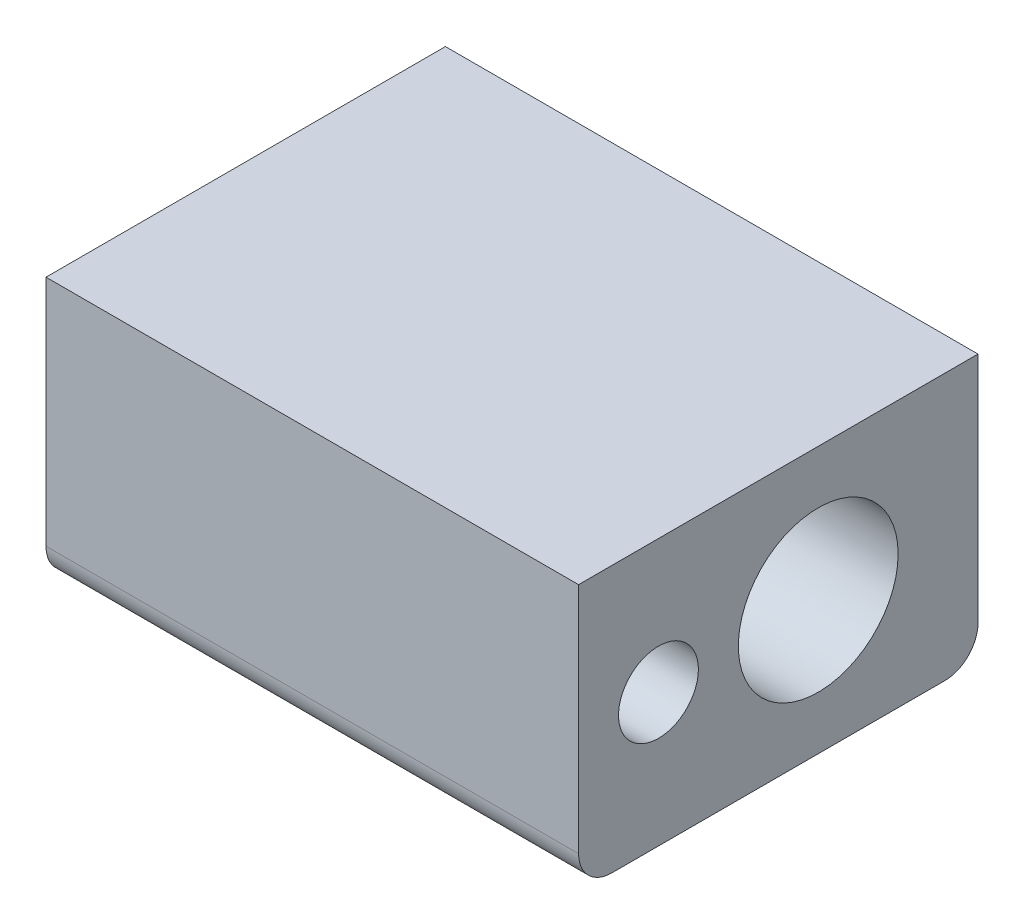
ISO-10303-21;
HEADER;
FILE_DESCRIPTION(('STEP AP214'),'2;1');
FILE_NAME('part.step','',(''),(''),'','','');
FILE_SCHEMA(('AUTOMOTIVE_DESIGN { 1 0 10303 214 1 1 1 1 }'));
ENDSEC;
DATA;
#1=APPLICATION_CONTEXT('core data for automotive mechanical design processes');
#2=APPLICATION_PROTOCOL_DEFINITION('international standard','automotive_design',2000,#1);
#3=PRODUCT_CONTEXT('',#1,'mechanical');
#4=PRODUCT('Part','Part','',(#3));
#5=PRODUCT_RELATED_PRODUCT_CATEGORY('part','',(#4));
#6=PRODUCT_DEFINITION_FORMATION('','',#4);
#7=PRODUCT_DEFINITION_CONTEXT('part definition',#1,'design');
#8=PRODUCT_DEFINITION('design','',#6,#7);
#9=PRODUCT_DEFINITION_SHAPE('','',#8);
#10=(LENGTH_UNIT() NAMED_UNIT(*) SI_UNIT(.MILLI.,.METRE.));
#11=(NAMED_UNIT(*) PLANE_ANGLE_UNIT() SI_UNIT($,.RADIAN.));
#12=(NAMED_UNIT(*) SI_UNIT($,.STERADIAN.) SOLID_ANGLE_UNIT());
#13=UNCERTAINTY_MEASURE_WITH_UNIT(LENGTH_MEASURE(1.E-05),#10,'distance_accuracy_value','');
#14=(GEOMETRIC_REPRESENTATION_CONTEXT(3) GLOBAL_UNCERTAINTY_ASSIGNED_CONTEXT((#13)) GLOBAL_UNIT_ASSIGNED_CONTEXT((#10,
#11,#12)) REPRESENTATION_CONTEXT('',''));
#15=CARTESIAN_POINT('',(0.,0.,0.));
#16=DIRECTION('',(0.,0.,1.));
#17=DIRECTION('',(1.,0.,0.));
#18=AXIS2_PLACEMENT_3D('',#15,#16,#17);
#19=CARTESIAN_POINT('',(101.6,0.,0.));
#20=DIRECTION('',(1.,0.,0.));
#21=DIRECTION('',(0.,0.,-1.));
#22=AXIS2_PLACEMENT_3D('',#19,#20,#21);
#23=PLANE('',#22);
#24=CARTESIAN_POINT('',(101.6,0.,-7.62000000000001));
#25=DIRECTION('',(1.,0.,0.));
#26=DIRECTION('',(0.,0.,-1.));
#27=AXIS2_PLACEMENT_3D('',#24,#25,#26);
#28=CIRCLE('',#27,15.24);
#29=CARTESIAN_POINT('',(101.6,0.,-22.86));
#30=VERTEX_POINT('',#29);
#31=EDGE_CURVE('E136',#30,#30,#28,.T.);
#32=ORIENTED_EDGE('',*,*,#31,.F.);
#33=EDGE_LOOP('',(#32));
#34=FACE_BOUND('',#33,.T.);
#35=DIRECTION('',(0.,0.,-1.));
#36=VECTOR('',#35,1.);
#37=CARTESIAN_POINT('',(101.6,-25.4,-38.1));
#38=LINE('',#37,#36);
#39=CARTESIAN_POINT('',(101.6,-25.4,31.75));
#40=VERTEX_POINT('',#39);
#41=CARTESIAN_POINT('',(101.6,-25.4,-31.75));
#42=VERTEX_POINT('',#41);
#43=EDGE_CURVE('E111',#40,#42,#38,.T.);
#44=ORIENTED_EDGE('',*,*,#43,.T.);
#45=CARTESIAN_POINT('',(101.6,-19.05,-31.75));
#46=DIRECTION('',(1.,0.,0.));
#47=DIRECTION('',(0.,0.,-1.));
#48=AXIS2_PLACEMENT_3D('',#45,#46,#47);
#49=CIRCLE('',#48,6.35);
#50=CARTESIAN_POINT('',(101.6,-19.05,-38.1));
#51=VERTEX_POINT('',#50);
#52=EDGE_CURVE('E54',#42,#51,#49,.T.);
#53=ORIENTED_EDGE('',*,*,#52,.T.);
#54=DIRECTION('',(0.,1.,0.));
#55=VECTOR('',#54,1.);
#56=CARTESIAN_POINT('',(101.6,25.4,-38.1));
#57=LINE('',#56,#55);
#58=CARTESIAN_POINT('',(101.6,25.4,-38.1));
#59=VERTEX_POINT('',#58);
#60=EDGE_CURVE('E100',#51,#59,#57,.T.);
#61=ORIENTED_EDGE('',*,*,#60,.T.);
#62=DIRECTION('',(0.,0.,1.));
#63=VECTOR('',#62,1.);
#64=CARTESIAN_POINT('',(101.6,25.4,-38.1));
#65=LINE('',#64,#63);
#66=CARTESIAN_POINT('',(101.6,25.4,38.1));
#67=VERTEX_POINT('',#66);
#68=EDGE_CURVE('E104',#59,#67,#65,.T.);
#69=ORIENTED_EDGE('',*,*,#68,.T.);
#70=DIRECTION('',(0.,-1.,0.));
#71=VECTOR('',#70,1.);
#72=CARTESIAN_POINT('',(101.6,25.4,38.1));
#73=LINE('',#72,#71);
#74=CARTESIAN_POINT('',(101.6,-19.05,38.1));
#75=VERTEX_POINT('',#74);
#76=EDGE_CURVE('E127',#67,#75,#73,.T.);
#77=ORIENTED_EDGE('',*,*,#76,.T.);
#78=CARTESIAN_POINT('',(101.6,-19.05,31.75));
#79=DIRECTION('',(1.,0.,0.));
#80=DIRECTION('',(0.,0.,-1.));
#81=AXIS2_PLACEMENT_3D('',#78,#79,#80);
#82=CIRCLE('',#81,6.35);
#83=EDGE_CURVE('E161',#75,#40,#82,.T.);
#84=ORIENTED_EDGE('',*,*,#83,.T.);
#85=EDGE_LOOP('',(#44,#53,#61,#69,#77,#84));
#86=FACE_BOUND('',#85,.T.);
#87=CARTESIAN_POINT('',(101.6,0.,22.86));
#88=DIRECTION('',(1.,0.,0.));
#89=DIRECTION('',(0.,0.,-1.));
#90=AXIS2_PLACEMENT_3D('',#87,#88,#89);
#91=CIRCLE('',#90,7.62);
#92=CARTESIAN_POINT('',(101.6,0.,15.24));
#93=VERTEX_POINT('',#92);
#94=EDGE_CURVE('E206',#93,#93,#91,.T.);
#95=ORIENTED_EDGE('',*,*,#94,.F.);
#96=EDGE_LOOP('',(#95));
#97=FACE_BOUND('',#96,.T.);
#98=ADVANCED_FACE('F45',(#34,#86,#97),#23,.T.);
#99=CARTESIAN_POINT('',(0.,0.,0.));
#100=DIRECTION('',(1.,0.,0.));
#101=DIRECTION('',(0.,0.,-1.));
#102=AXIS2_PLACEMENT_3D('',#99,#100,#101);
#103=PLANE('',#102);
#104=DIRECTION('',(0.,1.,0.));
#105=VECTOR('',#104,1.);
#106=CARTESIAN_POINT('',(0.,25.4,-38.1));
#107=LINE('',#106,#105);
#108=CARTESIAN_POINT('',(0.,-19.05,-38.1));
#109=VERTEX_POINT('',#108);
#110=CARTESIAN_POINT('',(0.,25.4,-38.1));
#111=VERTEX_POINT('',#110);
#112=EDGE_CURVE('E117',#109,#111,#107,.T.);
#113=ORIENTED_EDGE('',*,*,#112,.F.);
#114=CARTESIAN_POINT('',(0.,-19.05,-31.75));
#115=DIRECTION('',(1.,0.,0.));
#116=DIRECTION('',(0.,0.,-1.));
#117=AXIS2_PLACEMENT_3D('',#114,#115,#116);
#118=CIRCLE('',#117,6.35);
#119=CARTESIAN_POINT('',(0.,-25.4,-31.75));
#120=VERTEX_POINT('',#119);
#121=EDGE_CURVE('E152',#109,#120,#118,.F.);
#122=ORIENTED_EDGE('',*,*,#121,.T.);
#123=DIRECTION('',(0.,0.,-1.));
#124=VECTOR('',#123,1.);
#125=CARTESIAN_POINT('',(0.,-25.4,-38.1));
#126=LINE('',#125,#124);
#127=CARTESIAN_POINT('',(0.,-25.4,31.75));
#128=VERTEX_POINT('',#127);
#129=EDGE_CURVE('E133',#128,#120,#126,.T.);
#130=ORIENTED_EDGE('',*,*,#129,.F.);
#131=CARTESIAN_POINT('',(0.,-19.05,31.75));
#132=DIRECTION('',(1.,0.,0.));
#133=DIRECTION('',(0.,0.,-1.));
#134=AXIS2_PLACEMENT_3D('',#131,#132,#133);
#135=CIRCLE('',#134,6.35);
#136=CARTESIAN_POINT('',(0.,-19.05,38.1));
#137=VERTEX_POINT('',#136);
#138=EDGE_CURVE('E149',#128,#137,#135,.F.);
#139=ORIENTED_EDGE('',*,*,#138,.T.);
#140=DIRECTION('',(0.,-1.,0.));
#141=VECTOR('',#140,1.);
#142=CARTESIAN_POINT('',(0.,25.4,38.1));
#143=LINE('',#142,#141);
#144=CARTESIAN_POINT('',(0.,25.4,38.1));
#145=VERTEX_POINT('',#144);
#146=EDGE_CURVE('E142',#145,#137,#143,.T.);
#147=ORIENTED_EDGE('',*,*,#146,.F.);
#148=DIRECTION('',(0.,0.,1.));
#149=VECTOR('',#148,1.);
#150=CARTESIAN_POINT('',(0.,25.4,-38.1));
#151=LINE('',#150,#149);
#152=EDGE_CURVE('E139',#111,#145,#151,.T.);
#153=ORIENTED_EDGE('',*,*,#152,.F.);
#154=EDGE_LOOP('',(#113,#122,#130,#139,#147,#153));
#155=FACE_BOUND('',#154,.T.);
#156=CARTESIAN_POINT('',(0.,0.,-7.62000000000001));
#157=DIRECTION('',(1.,0.,0.));
#158=DIRECTION('',(0.,0.,-1.));
#159=AXIS2_PLACEMENT_3D('',#156,#157,#158);
#160=CIRCLE('',#159,15.24);
#161=CARTESIAN_POINT('',(0.,0.,-22.86));
#162=VERTEX_POINT('',#161);
#163=EDGE_CURVE('E214',#162,#162,#160,.T.);
#164=ORIENTED_EDGE('',*,*,#163,.T.);
#165=EDGE_LOOP('',(#164));
#166=FACE_BOUND('',#165,.T.);
#167=CARTESIAN_POINT('',(0.,0.,22.86));
#168=DIRECTION('',(1.,0.,0.));
#169=DIRECTION('',(0.,0.,-1.));
#170=AXIS2_PLACEMENT_3D('',#167,#168,#169);
#171=CIRCLE('',#170,7.62);
#172=CARTESIAN_POINT('',(0.,0.,15.24));
#173=VERTEX_POINT('',#172);
#174=EDGE_CURVE('E209',#173,#173,#171,.T.);
#175=ORIENTED_EDGE('',*,*,#174,.T.);
#176=EDGE_LOOP('',(#175));
#177=FACE_BOUND('',#176,.T.);
#178=ADVANCED_FACE('F172',(#155,#166,#177),#103,.F.);
#179=CARTESIAN_POINT('',(101.6,-25.4,-38.1));
#180=DIRECTION('',(0.,1.,0.));
#181=DIRECTION('',(0.,0.,1.));
#182=AXIS2_PLACEMENT_3D('',#179,#180,#181);
#183=PLANE('',#182);
#184=ORIENTED_EDGE('',*,*,#129,.T.);
#185=DIRECTION('',(-1.,0.,0.));
#186=VECTOR('',#185,1.);
#187=CARTESIAN_POINT('',(101.6,-25.4,-31.75));
#188=LINE('',#187,#186);
#189=EDGE_CURVE('E67',#120,#42,#188,.F.);
#190=ORIENTED_EDGE('',*,*,#189,.T.);
#191=ORIENTED_EDGE('',*,*,#43,.F.);
#192=DIRECTION('',(-1.,0.,0.));
#193=VECTOR('',#192,1.);
#194=CARTESIAN_POINT('',(101.6,-25.4,31.75));
#195=LINE('',#194,#193);
#196=EDGE_CURVE('E155',#40,#128,#195,.T.);
#197=ORIENTED_EDGE('',*,*,#196,.T.);
#198=EDGE_LOOP('',(#184,#190,#191,#197));
#199=FACE_BOUND('',#198,.T.);
#200=ADVANCED_FACE('F167',(#199),#183,.F.);
#201=CARTESIAN_POINT('',(101.6,25.4,-38.1));
#202=DIRECTION('',(0.,0.,1.));
#203=DIRECTION('',(0.,-1.,0.));
#204=AXIS2_PLACEMENT_3D('',#201,#202,#203);
#205=PLANE('',#204);
#206=ORIENTED_EDGE('',*,*,#60,.F.);
#207=DIRECTION('',(-1.,0.,0.));
#208=VECTOR('',#207,1.);
#209=CARTESIAN_POINT('',(101.6,-19.05,-38.1));
#210=LINE('',#209,#208);
#211=EDGE_CURVE('E121',#51,#109,#210,.T.);
#212=ORIENTED_EDGE('',*,*,#211,.T.);
#213=ORIENTED_EDGE('',*,*,#112,.T.);
#214=DIRECTION('',(-1.,0.,0.));
#215=VECTOR('',#214,1.);
#216=CARTESIAN_POINT('',(101.6,25.4,-38.1));
#217=LINE('',#216,#215);
#218=EDGE_CURVE('E114',#59,#111,#217,.T.);
#219=ORIENTED_EDGE('',*,*,#218,.F.);
#220=EDGE_LOOP('',(#206,#212,#213,#219));
#221=FACE_BOUND('',#220,.T.);
#222=ADVANCED_FACE('F115',(#221),#205,.F.);
#223=CARTESIAN_POINT('',(101.6,25.4,-38.1));
#224=DIRECTION('',(0.,-1.,0.));
#225=DIRECTION('',(0.,0.,-1.));
#226=AXIS2_PLACEMENT_3D('',#223,#224,#225);
#227=PLANE('',#226);
#228=ORIENTED_EDGE('',*,*,#152,.T.);
#229=DIRECTION('',(-1.,0.,0.));
#230=VECTOR('',#229,1.);
#231=CARTESIAN_POINT('',(101.6,25.4,38.1));
#232=LINE('',#231,#230);
#233=EDGE_CURVE('E122',#67,#145,#232,.T.);
#234=ORIENTED_EDGE('',*,*,#233,.F.);
#235=ORIENTED_EDGE('',*,*,#68,.F.);
#236=ORIENTED_EDGE('',*,*,#218,.T.);
#237=EDGE_LOOP('',(#228,#234,#235,#236));
#238=FACE_BOUND('',#237,.T.);
#239=ADVANCED_FACE('F124',(#238),#227,.F.);
#240=CARTESIAN_POINT('',(101.6,25.4,38.1));
#241=DIRECTION('',(0.,0.,-1.));
#242=DIRECTION('',(-1.,0.,0.));
#243=AXIS2_PLACEMENT_3D('',#240,#241,#242);
#244=PLANE('',#243);
#245=ORIENTED_EDGE('',*,*,#146,.T.);
#246=DIRECTION('',(-1.,0.,0.));
#247=VECTOR('',#246,1.);
#248=CARTESIAN_POINT('',(101.6,-19.05,38.1));
#249=LINE('',#248,#247);
#250=EDGE_CURVE('E11',#137,#75,#249,.F.);
#251=ORIENTED_EDGE('',*,*,#250,.T.);
#252=ORIENTED_EDGE('',*,*,#76,.F.);
#253=ORIENTED_EDGE('',*,*,#233,.T.);
#254=EDGE_LOOP('',(#245,#251,#252,#253));
#255=FACE_BOUND('',#254,.T.);
#256=ADVANCED_FACE('F174',(#255),#244,.F.);
#257=CARTESIAN_POINT('',(101.6,0.,-7.62000000000001));
#258=DIRECTION('',(-1.,0.,0.));
#259=DIRECTION('',(0.,0.,1.));
#260=AXIS2_PLACEMENT_3D('',#257,#258,#259);
#261=CYLINDRICAL_SURFACE('',#260,15.24);
#262=ORIENTED_EDGE('',*,*,#31,.T.);
#263=EDGE_LOOP('',(#262));
#264=FACE_BOUND('',#263,.T.);
#265=ORIENTED_EDGE('',*,*,#163,.F.);
#266=EDGE_LOOP('',(#265));
#267=FACE_BOUND('',#266,.T.);
#268=ADVANCED_FACE('F176',(#264,#267),#261,.F.);
#269=CARTESIAN_POINT('',(101.6,0.,22.86));
#270=DIRECTION('',(-1.,0.,0.));
#271=DIRECTION('',(0.,0.,1.));
#272=AXIS2_PLACEMENT_3D('',#269,#270,#271);
#273=CYLINDRICAL_SURFACE('',#272,7.62);
#274=ORIENTED_EDGE('',*,*,#94,.T.);
#275=EDGE_LOOP('',(#274));
#276=FACE_BOUND('',#275,.T.);
#277=ORIENTED_EDGE('',*,*,#174,.F.);
#278=EDGE_LOOP('',(#277));
#279=FACE_BOUND('',#278,.T.);
#280=ADVANCED_FACE('F183',(#276,#279),#273,.F.);
#281=CARTESIAN_POINT('',(101.6,-19.05,-31.75));
#282=DIRECTION('',(-1.,0.,0.));
#283=DIRECTION('',(0.,0.,1.));
#284=AXIS2_PLACEMENT_3D('',#281,#282,#283);
#285=CYLINDRICAL_SURFACE('',#284,6.35);
#286=ORIENTED_EDGE('',*,*,#52,.F.);
#287=ORIENTED_EDGE('',*,*,#189,.F.);
#288=ORIENTED_EDGE('',*,*,#121,.F.);
#289=ORIENTED_EDGE('',*,*,#211,.F.);
#290=EDGE_LOOP('',(#286,#287,#288,#289));
#291=FACE_BOUND('',#290,.T.);
#292=ADVANCED_FACE('F198',(#291),#285,.T.);
#293=CARTESIAN_POINT('',(101.6,-19.05,31.75));
#294=DIRECTION('',(-1.,0.,0.));
#295=DIRECTION('',(0.,0.,1.));
#296=AXIS2_PLACEMENT_3D('',#293,#294,#295);
#297=CYLINDRICAL_SURFACE('',#296,6.35);
#298=ORIENTED_EDGE('',*,*,#83,.F.);
#299=ORIENTED_EDGE('',*,*,#250,.F.);
#300=ORIENTED_EDGE('',*,*,#138,.F.);
#301=ORIENTED_EDGE('',*,*,#196,.F.);
#302=EDGE_LOOP('',(#298,#299,#300,#301));
#303=FACE_BOUND('',#302,.T.);
#304=ADVANCED_FACE('F47',(#303),#297,.T.);
#305=CLOSED_SHELL('',(#98,#178,#200,#222,#239,#256,#268,#280,#292,#304));
#306=MANIFOLD_SOLID_BREP('B2',#305);
#307=ADVANCED_BREP_SHAPE_REPRESENTATION('',(#18,#306),#14);
#308=SHAPE_DEFINITION_REPRESENTATION(#9,#307);
ENDSEC;
END-ISO-10303-21;
